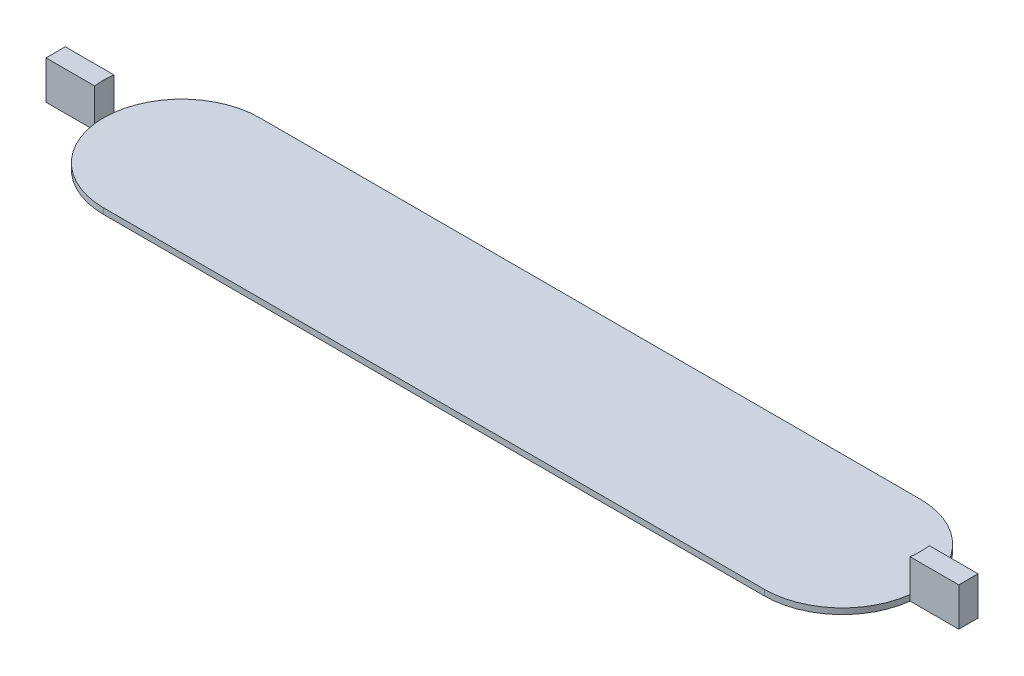
ISO-10303-21;
HEADER;
FILE_DESCRIPTION(('STEP AP214'),'2;1');
FILE_NAME('part.step','',(''),(''),'','','');
FILE_SCHEMA(('AUTOMOTIVE_DESIGN { 1 0 10303 214 1 1 1 1 }'));
ENDSEC;
DATA;
#1=APPLICATION_CONTEXT('core data for automotive mechanical design processes');
#2=APPLICATION_PROTOCOL_DEFINITION('international standard','automotive_design',2000,#1);
#3=PRODUCT_CONTEXT('',#1,'mechanical');
#4=PRODUCT('Part','Part','',(#3));
#5=PRODUCT_RELATED_PRODUCT_CATEGORY('part','',(#4));
#6=PRODUCT_DEFINITION_FORMATION('','',#4);
#7=PRODUCT_DEFINITION_CONTEXT('part definition',#1,'design');
#8=PRODUCT_DEFINITION('design','',#6,#7);
#9=PRODUCT_DEFINITION_SHAPE('','',#8);
#10=(LENGTH_UNIT() NAMED_UNIT(*) SI_UNIT(.MILLI.,.METRE.));
#11=(NAMED_UNIT(*) PLANE_ANGLE_UNIT() SI_UNIT($,.RADIAN.));
#12=(NAMED_UNIT(*) SI_UNIT($,.STERADIAN.) SOLID_ANGLE_UNIT());
#13=UNCERTAINTY_MEASURE_WITH_UNIT(LENGTH_MEASURE(1.E-05),#10,'distance_accuracy_value','');
#14=(GEOMETRIC_REPRESENTATION_CONTEXT(3) GLOBAL_UNCERTAINTY_ASSIGNED_CONTEXT((#13)) GLOBAL_UNIT_ASSIGNED_CONTEXT((#10,
#11,#12)) REPRESENTATION_CONTEXT('',''));
#15=CARTESIAN_POINT('',(0.,0.,0.));
#16=DIRECTION('',(0.,0.,1.));
#17=DIRECTION('',(1.,0.,0.));
#18=AXIS2_PLACEMENT_3D('',#15,#16,#17);
#19=CARTESIAN_POINT('',(397.464433618792,6.,41.6591342183315));
#20=DIRECTION('',(0.,-1.,0.));
#21=DIRECTION('',(0.,0.,-1.));
#22=AXIS2_PLACEMENT_3D('',#19,#20,#21);
#23=CYLINDRICAL_SURFACE('',#22,81.2037949567657);
#24=DIRECTION('',(0.,-1.,0.));
#25=VECTOR('',#24,1.);
#26=CARTESIAN_POINT('',(478.050141503591,40.,31.6591342140169));
#27=LINE('',#26,#25);
#28=CARTESIAN_POINT('',(478.050141503591,6.,31.6591342140169));
#29=VERTEX_POINT('',#28);
#30=CARTESIAN_POINT('',(478.050141503591,0.,31.6591342140169));
#31=VERTEX_POINT('',#30);
#32=EDGE_CURVE('E165',#29,#31,#27,.T.);
#33=ORIENTED_EDGE('',*,*,#32,.T.);
#34=CARTESIAN_POINT('',(397.464433618792,0.,41.6591342183315));
#35=DIRECTION('',(0.,1.,0.));
#36=DIRECTION('',(0.,0.,1.));
#37=AXIS2_PLACEMENT_3D('',#34,#35,#36);
#38=CIRCLE('',#37,81.2037949567657);
#39=CARTESIAN_POINT('',(397.464433618792,0.,-39.5446607384342));
#40=VERTEX_POINT('',#39);
#41=EDGE_CURVE('E231',#31,#40,#38,.T.);
#42=ORIENTED_EDGE('',*,*,#41,.T.);
#43=DIRECTION('',(0.,-1.,0.));
#44=VECTOR('',#43,1.);
#45=CARTESIAN_POINT('',(397.464433618792,6.,-39.5446607384342));
#46=LINE('',#45,#44);
#47=CARTESIAN_POINT('',(397.464433618792,6.,-39.5446607384342));
#48=VERTEX_POINT('',#47);
#49=EDGE_CURVE('E43',#48,#40,#46,.T.);
#50=ORIENTED_EDGE('',*,*,#49,.F.);
#51=CARTESIAN_POINT('',(397.464433618792,6.,41.6591342183315));
#52=DIRECTION('',(0.,1.,0.));
#53=DIRECTION('',(0.,0.,1.));
#54=AXIS2_PLACEMENT_3D('',#51,#52,#53);
#55=CIRCLE('',#54,81.2037949567657);
#56=EDGE_CURVE('E50',#29,#48,#55,.T.);
#57=ORIENTED_EDGE('',*,*,#56,.F.);
#58=EDGE_LOOP('',(#33,#42,#50,#57));
#59=FACE_BOUND('',#58,.T.);
#60=ADVANCED_FACE('F35',(#59),#23,.T.);
#61=CARTESIAN_POINT('',(-290.127976467677,6.,41.6591342183315));
#62=DIRECTION('',(0.,-1.,0.));
#63=DIRECTION('',(0.,0.,-1.));
#64=AXIS2_PLACEMENT_3D('',#61,#62,#63);
#65=CYLINDRICAL_SURFACE('',#64,81.2037949567654);
#66=DIRECTION('',(0.,-1.,0.));
#67=VECTOR('',#66,1.);
#68=CARTESIAN_POINT('',(-370.713684353044,40.,51.6591342180662));
#69=LINE('',#68,#67);
#70=CARTESIAN_POINT('',(-370.713684353044,6.,51.6591342180662));
#71=VERTEX_POINT('',#70);
#72=CARTESIAN_POINT('',(-370.713684353044,0.,51.6591342180662));
#73=VERTEX_POINT('',#72);
#74=EDGE_CURVE('E192',#71,#73,#69,.T.);
#75=ORIENTED_EDGE('',*,*,#74,.T.);
#76=CARTESIAN_POINT('',(-290.127976467677,0.,41.6591342183315));
#77=DIRECTION('',(0.,1.,0.));
#78=DIRECTION('',(0.,0.,1.));
#79=AXIS2_PLACEMENT_3D('',#76,#77,#78);
#80=CIRCLE('',#79,81.2037949567654);
#81=CARTESIAN_POINT('',(-290.127976467677,0.,122.862929175097));
#82=VERTEX_POINT('',#81);
#83=EDGE_CURVE('E237',#73,#82,#80,.T.);
#84=ORIENTED_EDGE('',*,*,#83,.T.);
#85=DIRECTION('',(0.,-1.,0.));
#86=VECTOR('',#85,1.);
#87=CARTESIAN_POINT('',(-290.127976467677,6.,122.862929175097));
#88=LINE('',#87,#86);
#89=CARTESIAN_POINT('',(-290.127976467677,6.,122.862929175097));
#90=VERTEX_POINT('',#89);
#91=EDGE_CURVE('E228',#90,#82,#88,.T.);
#92=ORIENTED_EDGE('',*,*,#91,.F.);
#93=CARTESIAN_POINT('',(-290.127976467677,6.,41.6591342183315));
#94=DIRECTION('',(0.,1.,0.));
#95=DIRECTION('',(0.,0.,1.));
#96=AXIS2_PLACEMENT_3D('',#93,#94,#95);
#97=CIRCLE('',#96,81.2037949567654);
#98=EDGE_CURVE('E224',#71,#90,#97,.T.);
#99=ORIENTED_EDGE('',*,*,#98,.F.);
#100=EDGE_LOOP('',(#75,#84,#92,#99));
#101=FACE_BOUND('',#100,.T.);
#102=ADVANCED_FACE('F277',(#101),#65,.T.);
#103=CARTESIAN_POINT('',(0.,6.,122.862929175097));
#104=DIRECTION('',(0.,0.,-1.));
#105=DIRECTION('',(-1.,0.,0.));
#106=AXIS2_PLACEMENT_3D('',#103,#104,#105);
#107=PLANE('',#106);
#108=DIRECTION('',(1.,0.,0.));
#109=VECTOR('',#108,1.);
#110=CARTESIAN_POINT('',(0.,0.,122.862929175097));
#111=LINE('',#110,#109);
#112=CARTESIAN_POINT('',(397.464433618792,0.,122.862929175097));
#113=VERTEX_POINT('',#112);
#114=EDGE_CURVE('E214',#82,#113,#111,.T.);
#115=ORIENTED_EDGE('',*,*,#114,.T.);
#116=DIRECTION('',(0.,-1.,0.));
#117=VECTOR('',#116,1.);
#118=CARTESIAN_POINT('',(397.464433618792,6.,122.862929175097));
#119=LINE('',#118,#117);
#120=CARTESIAN_POINT('',(397.464433618792,6.,122.862929175097));
#121=VERTEX_POINT('',#120);
#122=EDGE_CURVE('E11',#121,#113,#119,.T.);
#123=ORIENTED_EDGE('',*,*,#122,.F.);
#124=DIRECTION('',(1.,0.,0.));
#125=VECTOR('',#124,1.);
#126=CARTESIAN_POINT('',(0.,6.,122.862929175097));
#127=LINE('',#126,#125);
#128=EDGE_CURVE('E215',#90,#121,#127,.T.);
#129=ORIENTED_EDGE('',*,*,#128,.F.);
#130=ORIENTED_EDGE('',*,*,#91,.T.);
#131=EDGE_LOOP('',(#115,#123,#129,#130));
#132=FACE_BOUND('',#131,.T.);
#133=ADVANCED_FACE('F37',(#132),#107,.F.);
#134=CARTESIAN_POINT('',(478.050141504662,0.,51.6591342140169));
#135=VERTEX_POINT('',#134);
#136=EDGE_CURVE('E232',#113,#135,#38,.T.);
#137=ORIENTED_EDGE('',*,*,#136,.T.);
#138=DIRECTION('',(0.,-1.,0.));
#139=VECTOR('',#138,1.);
#140=CARTESIAN_POINT('',(478.050141504662,40.,51.6591342140169));
#141=LINE('',#140,#139);
#142=CARTESIAN_POINT('',(478.050141504662,6.,51.6591342140169));
#143=VERTEX_POINT('',#142);
#144=EDGE_CURVE('E58',#143,#135,#141,.T.);
#145=ORIENTED_EDGE('',*,*,#144,.F.);
#146=EDGE_CURVE('E219',#121,#143,#55,.T.);
#147=ORIENTED_EDGE('',*,*,#146,.F.);
#148=ORIENTED_EDGE('',*,*,#122,.T.);
#149=EDGE_LOOP('',(#137,#145,#147,#148));
#150=FACE_BOUND('',#149,.T.);
#151=ADVANCED_FACE('F286',(#150),#23,.T.);
#152=CARTESIAN_POINT('',(0.,6.,-39.5446607384341));
#153=DIRECTION('',(0.,0.,-1.));
#154=DIRECTION('',(-1.,0.,0.));
#155=AXIS2_PLACEMENT_3D('',#152,#153,#154);
#156=PLANE('',#155);
#157=DIRECTION('',(1.,0.,0.));
#158=VECTOR('',#157,1.);
#159=CARTESIAN_POINT('',(0.,0.,-39.5446607384341));
#160=LINE('',#159,#158);
#161=CARTESIAN_POINT('',(-290.127976467677,0.,-39.544660738434));
#162=VERTEX_POINT('',#161);
#163=EDGE_CURVE('E234',#162,#40,#160,.T.);
#164=ORIENTED_EDGE('',*,*,#163,.F.);
#165=DIRECTION('',(0.,-1.,0.));
#166=VECTOR('',#165,1.);
#167=CARTESIAN_POINT('',(-290.127976467677,6.,-39.544660738434));
#168=LINE('',#167,#166);
#169=CARTESIAN_POINT('',(-290.127976467677,6.,-39.544660738434));
#170=VERTEX_POINT('',#169);
#171=EDGE_CURVE('E241',#170,#162,#168,.T.);
#172=ORIENTED_EDGE('',*,*,#171,.F.);
#173=DIRECTION('',(1.,0.,0.));
#174=VECTOR('',#173,1.);
#175=CARTESIAN_POINT('',(0.,6.,-39.5446607384341));
#176=LINE('',#175,#174);
#177=EDGE_CURVE('E221',#170,#48,#176,.T.);
#178=ORIENTED_EDGE('',*,*,#177,.T.);
#179=ORIENTED_EDGE('',*,*,#49,.T.);
#180=EDGE_LOOP('',(#164,#172,#178,#179));
#181=FACE_BOUND('',#180,.T.);
#182=ADVANCED_FACE('F245',(#181),#156,.T.);
#183=CARTESIAN_POINT('',(-370.713684352978,0.,31.6591342180657));
#184=VERTEX_POINT('',#183);
#185=EDGE_CURVE('E218',#162,#184,#80,.T.);
#186=ORIENTED_EDGE('',*,*,#185,.T.);
#187=DIRECTION('',(0.,-1.,0.));
#188=VECTOR('',#187,1.);
#189=CARTESIAN_POINT('',(-370.713684352978,40.,31.6591342180657));
#190=LINE('',#189,#188);
#191=CARTESIAN_POINT('',(-370.713684352978,6.,31.6591342180657));
#192=VERTEX_POINT('',#191);
#193=EDGE_CURVE('E207',#192,#184,#190,.T.);
#194=ORIENTED_EDGE('',*,*,#193,.F.);
#195=EDGE_CURVE('E225',#170,#192,#97,.T.);
#196=ORIENTED_EDGE('',*,*,#195,.F.);
#197=ORIENTED_EDGE('',*,*,#171,.T.);
#198=EDGE_LOOP('',(#186,#194,#196,#197));
#199=FACE_BOUND('',#198,.T.);
#200=ADVANCED_FACE('F256',(#199),#65,.T.);
#201=CARTESIAN_POINT('',(0.,6.,0.));
#202=DIRECTION('',(0.,1.,0.));
#203=DIRECTION('',(0.,0.,1.));
#204=AXIS2_PLACEMENT_3D('',#201,#202,#203);
#205=PLANE('',#204);
#206=ORIENTED_EDGE('',*,*,#128,.T.);
#207=ORIENTED_EDGE('',*,*,#146,.T.);
#208=CARTESIAN_POINT('',(397.464433618792,6.,41.6591342183315));
#209=DIRECTION('',(0.,1.,0.));
#210=DIRECTION('',(0.,0.,1.));
#211=AXIS2_PLACEMENT_3D('',#208,#209,#210);
#212=CIRCLE('',#211,81.2037949567657);
#213=EDGE_CURVE('E143',#29,#143,#212,.F.);
#214=ORIENTED_EDGE('',*,*,#213,.F.);
#215=ORIENTED_EDGE('',*,*,#56,.T.);
#216=ORIENTED_EDGE('',*,*,#177,.F.);
#217=ORIENTED_EDGE('',*,*,#195,.T.);
#218=CARTESIAN_POINT('',(-290.127976467677,6.,41.6591342183315));
#219=DIRECTION('',(0.,1.,0.));
#220=DIRECTION('',(0.,0.,1.));
#221=AXIS2_PLACEMENT_3D('',#218,#219,#220);
#222=CIRCLE('',#221,81.2037949567654);
#223=EDGE_CURVE('E211',#71,#192,#222,.F.);
#224=ORIENTED_EDGE('',*,*,#223,.F.);
#225=ORIENTED_EDGE('',*,*,#98,.T.);
#226=EDGE_LOOP('',(#206,#207,#214,#215,#216,#217,#224,#225));
#227=FACE_BOUND('',#226,.T.);
#228=ADVANCED_FACE('F281',(#227),#205,.T.);
#229=CARTESIAN_POINT('',(0.,0.,0.));
#230=DIRECTION('',(0.,1.,0.));
#231=DIRECTION('',(0.,0.,1.));
#232=AXIS2_PLACEMENT_3D('',#229,#230,#231);
#233=PLANE('',#232);
#234=ORIENTED_EDGE('',*,*,#114,.F.);
#235=ORIENTED_EDGE('',*,*,#83,.F.);
#236=DIRECTION('',(1.,0.,0.));
#237=VECTOR('',#236,1.);
#238=CARTESIAN_POINT('',(0.,0.,51.6591342180662));
#239=LINE('',#238,#237);
#240=CARTESIAN_POINT('',(-421.331771424475,0.,51.6591342180662));
#241=VERTEX_POINT('',#240);
#242=EDGE_CURVE('E185',#241,#73,#239,.T.);
#243=ORIENTED_EDGE('',*,*,#242,.F.);
#244=DIRECTION('',(0.,0.,1.));
#245=VECTOR('',#244,1.);
#246=CARTESIAN_POINT('',(-421.331771424475,0.,0.));
#247=LINE('',#246,#245);
#248=CARTESIAN_POINT('',(-421.331771424475,0.,31.6591342180656));
#249=VERTEX_POINT('',#248);
#250=EDGE_CURVE('E195',#249,#241,#247,.T.);
#251=ORIENTED_EDGE('',*,*,#250,.F.);
#252=DIRECTION('',(1.,0.,0.));
#253=VECTOR('',#252,1.);
#254=CARTESIAN_POINT('',(0.,0.,31.659134218066));
#255=LINE('',#254,#253);
#256=EDGE_CURVE('E180',#249,#184,#255,.T.);
#257=ORIENTED_EDGE('',*,*,#256,.T.);
#258=ORIENTED_EDGE('',*,*,#185,.F.);
#259=ORIENTED_EDGE('',*,*,#163,.T.);
#260=ORIENTED_EDGE('',*,*,#41,.F.);
#261=DIRECTION('',(-1.,0.,0.));
#262=VECTOR('',#261,1.);
#263=CARTESIAN_POINT('',(0.,0.,31.6591342140173));
#264=LINE('',#263,#262);
#265=CARTESIAN_POINT('',(528.668228575558,0.,31.6591342140169));
#266=VERTEX_POINT('',#265);
#267=EDGE_CURVE('E154',#266,#31,#264,.T.);
#268=ORIENTED_EDGE('',*,*,#267,.F.);
#269=DIRECTION('',(0.,0.,-1.));
#270=VECTOR('',#269,1.);
#271=CARTESIAN_POINT('',(528.668228575558,0.,0.));
#272=LINE('',#271,#270);
#273=CARTESIAN_POINT('',(528.668228575558,0.,51.6591342140169));
#274=VERTEX_POINT('',#273);
#275=EDGE_CURVE('E169',#274,#266,#272,.T.);
#276=ORIENTED_EDGE('',*,*,#275,.F.);
#277=DIRECTION('',(-1.,0.,0.));
#278=VECTOR('',#277,1.);
#279=CARTESIAN_POINT('',(0.,0.,51.659134214017));
#280=LINE('',#279,#278);
#281=EDGE_CURVE('E166',#274,#135,#280,.T.);
#282=ORIENTED_EDGE('',*,*,#281,.T.);
#283=ORIENTED_EDGE('',*,*,#136,.F.);
#284=EDGE_LOOP('',(#234,#235,#243,#251,#257,#258,#259,#260,#268,#276,#282,#283));
#285=FACE_BOUND('',#284,.T.);
#286=ADVANCED_FACE('F250',(#285),#233,.F.);
#287=CARTESIAN_POINT('',(-290.127976467677,40.,41.6591342183315));
#288=DIRECTION('',(0.,-1.,0.));
#289=DIRECTION('',(0.,0.,-1.));
#290=AXIS2_PLACEMENT_3D('',#287,#288,#289);
#291=CYLINDRICAL_SURFACE('',#290,81.2037949567654);
#292=CARTESIAN_POINT('',(-370.713684353044,40.,51.6591342180662));
#293=VERTEX_POINT('',#292);
#294=EDGE_CURVE('E199',#293,#71,#69,.T.);
#295=ORIENTED_EDGE('',*,*,#294,.T.);
#296=ORIENTED_EDGE('',*,*,#223,.T.);
#297=CARTESIAN_POINT('',(-370.713684352978,40.,31.6591342180657));
#298=VERTEX_POINT('',#297);
#299=EDGE_CURVE('E208',#298,#192,#190,.T.);
#300=ORIENTED_EDGE('',*,*,#299,.F.);
#301=CARTESIAN_POINT('',(-290.127976467677,40.,41.6591342183315));
#302=DIRECTION('',(0.,1.,0.));
#303=DIRECTION('',(0.,0.,1.));
#304=AXIS2_PLACEMENT_3D('',#301,#302,#303);
#305=CIRCLE('',#304,81.2037949567654);
#306=EDGE_CURVE('E181',#298,#293,#305,.T.);
#307=ORIENTED_EDGE('',*,*,#306,.T.);
#308=EDGE_LOOP('',(#295,#296,#300,#307));
#309=FACE_BOUND('',#308,.T.);
#310=ADVANCED_FACE('F263',(#309),#291,.F.);
#311=CARTESIAN_POINT('',(0.,40.,31.659134218066));
#312=DIRECTION('',(0.,0.,-1.));
#313=DIRECTION('',(-1.,0.,0.));
#314=AXIS2_PLACEMENT_3D('',#311,#312,#313);
#315=PLANE('',#314);
#316=ORIENTED_EDGE('',*,*,#256,.F.);
#317=DIRECTION('',(0.,-1.,0.));
#318=VECTOR('',#317,1.);
#319=CARTESIAN_POINT('',(-421.331771424475,40.,31.6591342180656));
#320=LINE('',#319,#318);
#321=CARTESIAN_POINT('',(-421.331771424475,40.,31.6591342180656));
#322=VERTEX_POINT('',#321);
#323=EDGE_CURVE('E205',#322,#249,#320,.T.);
#324=ORIENTED_EDGE('',*,*,#323,.F.);
#325=DIRECTION('',(1.,0.,0.));
#326=VECTOR('',#325,1.);
#327=CARTESIAN_POINT('',(0.,40.,31.659134218066));
#328=LINE('',#327,#326);
#329=EDGE_CURVE('E184',#322,#298,#328,.T.);
#330=ORIENTED_EDGE('',*,*,#329,.T.);
#331=ORIENTED_EDGE('',*,*,#299,.T.);
#332=ORIENTED_EDGE('',*,*,#193,.T.);
#333=EDGE_LOOP('',(#316,#324,#330,#331,#332));
#334=FACE_BOUND('',#333,.T.);
#335=ADVANCED_FACE('F259',(#334),#315,.T.);
#336=CARTESIAN_POINT('',(-421.331771424475,40.,0.));
#337=DIRECTION('',(1.,0.,0.));
#338=DIRECTION('',(0.,0.,-1.));
#339=AXIS2_PLACEMENT_3D('',#336,#337,#338);
#340=PLANE('',#339);
#341=ORIENTED_EDGE('',*,*,#250,.T.);
#342=DIRECTION('',(0.,-1.,0.));
#343=VECTOR('',#342,1.);
#344=CARTESIAN_POINT('',(-421.331771424475,40.,51.6591342180662));
#345=LINE('',#344,#343);
#346=CARTESIAN_POINT('',(-421.331771424475,40.,51.6591342180662));
#347=VERTEX_POINT('',#346);
#348=EDGE_CURVE('E202',#347,#241,#345,.T.);
#349=ORIENTED_EDGE('',*,*,#348,.F.);
#350=DIRECTION('',(0.,0.,1.));
#351=VECTOR('',#350,1.);
#352=CARTESIAN_POINT('',(-421.331771424475,40.,0.));
#353=LINE('',#352,#351);
#354=EDGE_CURVE('E188',#322,#347,#353,.T.);
#355=ORIENTED_EDGE('',*,*,#354,.F.);
#356=ORIENTED_EDGE('',*,*,#323,.T.);
#357=EDGE_LOOP('',(#341,#349,#355,#356));
#358=FACE_BOUND('',#357,.T.);
#359=ADVANCED_FACE('F319',(#358),#340,.F.);
#360=CARTESIAN_POINT('',(0.,40.,51.6591342180662));
#361=DIRECTION('',(0.,0.,-1.));
#362=DIRECTION('',(-1.,0.,0.));
#363=AXIS2_PLACEMENT_3D('',#360,#361,#362);
#364=PLANE('',#363);
#365=ORIENTED_EDGE('',*,*,#242,.T.);
#366=ORIENTED_EDGE('',*,*,#74,.F.);
#367=ORIENTED_EDGE('',*,*,#294,.F.);
#368=DIRECTION('',(1.,0.,0.));
#369=VECTOR('',#368,1.);
#370=CARTESIAN_POINT('',(0.,40.,51.6591342180662));
#371=LINE('',#370,#369);
#372=EDGE_CURVE('E190',#347,#293,#371,.T.);
#373=ORIENTED_EDGE('',*,*,#372,.F.);
#374=ORIENTED_EDGE('',*,*,#348,.T.);
#375=EDGE_LOOP('',(#365,#366,#367,#373,#374));
#376=FACE_BOUND('',#375,.T.);
#377=ADVANCED_FACE('F273',(#376),#364,.F.);
#378=CARTESIAN_POINT('',(0.,40.,0.));
#379=DIRECTION('',(0.,1.,0.));
#380=DIRECTION('',(0.,0.,1.));
#381=AXIS2_PLACEMENT_3D('',#378,#379,#380);
#382=PLANE('',#381);
#383=ORIENTED_EDGE('',*,*,#306,.F.);
#384=ORIENTED_EDGE('',*,*,#329,.F.);
#385=ORIENTED_EDGE('',*,*,#354,.T.);
#386=ORIENTED_EDGE('',*,*,#372,.T.);
#387=EDGE_LOOP('',(#383,#384,#385,#386));
#388=FACE_BOUND('',#387,.T.);
#389=ADVANCED_FACE('F266',(#388),#382,.T.);
#390=CARTESIAN_POINT('',(397.464433618792,40.,41.6591342183315));
#391=DIRECTION('',(0.,-1.,0.));
#392=DIRECTION('',(0.,0.,-1.));
#393=AXIS2_PLACEMENT_3D('',#390,#391,#392);
#394=CYLINDRICAL_SURFACE('',#393,81.2037949567657);
#395=CARTESIAN_POINT('',(478.050141503591,40.,31.6591342140169));
#396=VERTEX_POINT('',#395);
#397=EDGE_CURVE('E173',#396,#29,#27,.T.);
#398=ORIENTED_EDGE('',*,*,#397,.T.);
#399=ORIENTED_EDGE('',*,*,#213,.T.);
#400=CARTESIAN_POINT('',(478.050141504662,40.,51.6591342140169));
#401=VERTEX_POINT('',#400);
#402=EDGE_CURVE('E138',#401,#143,#141,.T.);
#403=ORIENTED_EDGE('',*,*,#402,.F.);
#404=CARTESIAN_POINT('',(397.464433618792,40.,41.6591342183315));
#405=DIRECTION('',(0.,1.,0.));
#406=DIRECTION('',(0.,0.,1.));
#407=AXIS2_PLACEMENT_3D('',#404,#405,#406);
#408=CIRCLE('',#407,81.2037949567657);
#409=EDGE_CURVE('E142',#401,#396,#408,.T.);
#410=ORIENTED_EDGE('',*,*,#409,.T.);
#411=EDGE_LOOP('',(#398,#399,#403,#410));
#412=FACE_BOUND('',#411,.T.);
#413=ADVANCED_FACE('F141',(#412),#394,.F.);
#414=CARTESIAN_POINT('',(0.,40.,51.659134214017));
#415=DIRECTION('',(0.,0.,1.));
#416=DIRECTION('',(1.,0.,0.));
#417=AXIS2_PLACEMENT_3D('',#414,#415,#416);
#418=PLANE('',#417);
#419=ORIENTED_EDGE('',*,*,#281,.F.);
#420=DIRECTION('',(0.,-1.,0.));
#421=VECTOR('',#420,1.);
#422=CARTESIAN_POINT('',(528.668228575558,40.,51.6591342140169));
#423=LINE('',#422,#421);
#424=CARTESIAN_POINT('',(528.668228575558,40.,51.6591342140169));
#425=VERTEX_POINT('',#424);
#426=EDGE_CURVE('E158',#425,#274,#423,.T.);
#427=ORIENTED_EDGE('',*,*,#426,.F.);
#428=DIRECTION('',(-1.,0.,0.));
#429=VECTOR('',#428,1.);
#430=CARTESIAN_POINT('',(0.,40.,51.659134214017));
#431=LINE('',#430,#429);
#432=EDGE_CURVE('E150',#425,#401,#431,.T.);
#433=ORIENTED_EDGE('',*,*,#432,.T.);
#434=ORIENTED_EDGE('',*,*,#402,.T.);
#435=ORIENTED_EDGE('',*,*,#144,.T.);
#436=EDGE_LOOP('',(#419,#427,#433,#434,#435));
#437=FACE_BOUND('',#436,.T.);
#438=ADVANCED_FACE('F157',(#437),#418,.T.);
#439=CARTESIAN_POINT('',(528.668228575558,40.,0.));
#440=DIRECTION('',(-1.,0.,0.));
#441=DIRECTION('',(0.,0.,1.));
#442=AXIS2_PLACEMENT_3D('',#439,#440,#441);
#443=PLANE('',#442);
#444=ORIENTED_EDGE('',*,*,#275,.T.);
#445=DIRECTION('',(0.,-1.,0.));
#446=VECTOR('',#445,1.);
#447=CARTESIAN_POINT('',(528.668228575558,40.,31.6591342140169));
#448=LINE('',#447,#446);
#449=CARTESIAN_POINT('',(528.668228575558,40.,31.6591342140169));
#450=VERTEX_POINT('',#449);
#451=EDGE_CURVE('E175',#450,#266,#448,.T.);
#452=ORIENTED_EDGE('',*,*,#451,.F.);
#453=DIRECTION('',(0.,0.,-1.));
#454=VECTOR('',#453,1.);
#455=CARTESIAN_POINT('',(528.668228575558,40.,0.));
#456=LINE('',#455,#454);
#457=EDGE_CURVE('E160',#425,#450,#456,.T.);
#458=ORIENTED_EDGE('',*,*,#457,.F.);
#459=ORIENTED_EDGE('',*,*,#426,.T.);
#460=EDGE_LOOP('',(#444,#452,#458,#459));
#461=FACE_BOUND('',#460,.T.);
#462=ADVANCED_FACE('F302',(#461),#443,.F.);
#463=CARTESIAN_POINT('',(0.,40.,31.6591342140173));
#464=DIRECTION('',(0.,0.,1.));
#465=DIRECTION('',(1.,0.,0.));
#466=AXIS2_PLACEMENT_3D('',#463,#464,#465);
#467=PLANE('',#466);
#468=ORIENTED_EDGE('',*,*,#267,.T.);
#469=ORIENTED_EDGE('',*,*,#32,.F.);
#470=ORIENTED_EDGE('',*,*,#397,.F.);
#471=DIRECTION('',(-1.,0.,0.));
#472=VECTOR('',#471,1.);
#473=CARTESIAN_POINT('',(0.,40.,31.6591342140173));
#474=LINE('',#473,#472);
#475=EDGE_CURVE('E152',#450,#396,#474,.T.);
#476=ORIENTED_EDGE('',*,*,#475,.F.);
#477=ORIENTED_EDGE('',*,*,#451,.T.);
#478=EDGE_LOOP('',(#468,#469,#470,#476,#477));
#479=FACE_BOUND('',#478,.T.);
#480=ADVANCED_FACE('F284',(#479),#467,.F.);
#481=CARTESIAN_POINT('',(0.,40.,0.));
#482=DIRECTION('',(0.,1.,0.));
#483=DIRECTION('',(0.,0.,1.));
#484=AXIS2_PLACEMENT_3D('',#481,#482,#483);
#485=PLANE('',#484);
#486=ORIENTED_EDGE('',*,*,#409,.F.);
#487=ORIENTED_EDGE('',*,*,#432,.F.);
#488=ORIENTED_EDGE('',*,*,#457,.T.);
#489=ORIENTED_EDGE('',*,*,#475,.T.);
#490=EDGE_LOOP('',(#486,#487,#488,#489));
#491=FACE_BOUND('',#490,.T.);
#492=ADVANCED_FACE('F149',(#491),#485,.T.);
#493=CLOSED_SHELL('',(#60,#102,#133,#151,#182,#200,#228,#286,#310,#335,#359,#377,#389,#413,#438,
#462,#480,#492));
#494=MANIFOLD_SOLID_BREP('B2',#493);
#495=ADVANCED_BREP_SHAPE_REPRESENTATION('',(#18,#494),#14);
#496=SHAPE_DEFINITION_REPRESENTATION(#9,#495);
ENDSEC;
END-ISO-10303-21;
